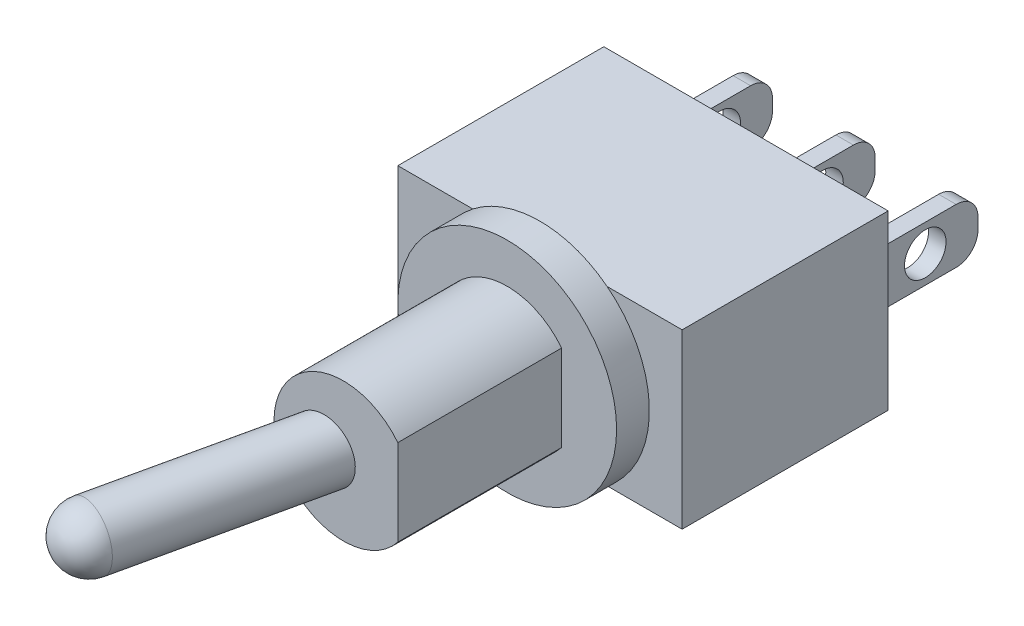
ISO-10303-21;
HEADER;
FILE_DESCRIPTION(('STEP AP214'),'2;1');
FILE_NAME('part.step','',(''),(''),'','','');
FILE_SCHEMA(('AUTOMOTIVE_DESIGN { 1 0 10303 214 1 1 1 1 }'));
ENDSEC;
DATA;
#1=APPLICATION_CONTEXT('core data for automotive mechanical design processes');
#2=APPLICATION_PROTOCOL_DEFINITION('international standard','automotive_design',2000,#1);
#3=PRODUCT_CONTEXT('',#1,'mechanical');
#4=PRODUCT('Part','Part','',(#3));
#5=PRODUCT_RELATED_PRODUCT_CATEGORY('part','',(#4));
#6=PRODUCT_DEFINITION_FORMATION('','',#4);
#7=PRODUCT_DEFINITION_CONTEXT('part definition',#1,'design');
#8=PRODUCT_DEFINITION('design','',#6,#7);
#9=PRODUCT_DEFINITION_SHAPE('','',#8);
#10=(LENGTH_UNIT() NAMED_UNIT(*) SI_UNIT(.MILLI.,.METRE.));
#11=(NAMED_UNIT(*) PLANE_ANGLE_UNIT() SI_UNIT($,.RADIAN.));
#12=(NAMED_UNIT(*) SI_UNIT($,.STERADIAN.) SOLID_ANGLE_UNIT());
#13=UNCERTAINTY_MEASURE_WITH_UNIT(LENGTH_MEASURE(1.E-05),#10,'distance_accuracy_value','');
#14=(GEOMETRIC_REPRESENTATION_CONTEXT(3) GLOBAL_UNCERTAINTY_ASSIGNED_CONTEXT((#13)) GLOBAL_UNIT_ASSIGNED_CONTEXT((#10,
#11,#12)) REPRESENTATION_CONTEXT('',''));
#15=CARTESIAN_POINT('',(0.,0.,0.));
#16=DIRECTION('',(0.,0.,1.));
#17=DIRECTION('',(1.,0.,0.));
#18=AXIS2_PLACEMENT_3D('',#15,#16,#17);
#19=CARTESIAN_POINT('',(0.,0.,0.));
#20=DIRECTION('',(0.,0.,1.));
#21=DIRECTION('',(1.,0.,0.));
#22=AXIS2_PLACEMENT_3D('',#19,#20,#21);
#23=PLANE('',#22);
#24=CARTESIAN_POINT('',(0.,0.,0.));
#25=DIRECTION('',(0.,0.,1.));
#26=DIRECTION('',(1.,0.,0.));
#27=AXIS2_PLACEMENT_3D('',#24,#25,#26);
#28=CIRCLE('',#27,5.0038);
#29=CARTESIAN_POINT('',(-3.07211398714306,3.9497,0.));
#30=VERTEX_POINT('',#29);
#31=CARTESIAN_POINT('',(-3.07211398714305,-3.9497,0.));
#32=VERTEX_POINT('',#31);
#33=EDGE_CURVE('E11',#30,#32,#28,.T.);
#34=ORIENTED_EDGE('',*,*,#33,.F.);
#35=DIRECTION('',(-1.,0.,0.));
#36=VECTOR('',#35,1.);
#37=CARTESIAN_POINT('',(6.5024,3.9497,0.));
#38=LINE('',#37,#36);
#39=CARTESIAN_POINT('',(-6.5024,3.9497,0.));
#40=VERTEX_POINT('',#39);
#41=EDGE_CURVE('E413',#30,#40,#38,.T.);
#42=ORIENTED_EDGE('',*,*,#41,.T.);
#43=DIRECTION('',(0.,1.,0.));
#44=VECTOR('',#43,1.);
#45=CARTESIAN_POINT('',(-6.5024,-3.9497,0.));
#46=LINE('',#45,#44);
#47=CARTESIAN_POINT('',(-6.5024,-3.9497,0.));
#48=VERTEX_POINT('',#47);
#49=EDGE_CURVE('E416',#48,#40,#46,.T.);
#50=ORIENTED_EDGE('',*,*,#49,.F.);
#51=DIRECTION('',(-1.,0.,0.));
#52=VECTOR('',#51,1.);
#53=CARTESIAN_POINT('',(6.5024,-3.9497,0.));
#54=LINE('',#53,#52);
#55=EDGE_CURVE('E68',#32,#48,#54,.T.);
#56=ORIENTED_EDGE('',*,*,#55,.F.);
#57=EDGE_LOOP('',(#34,#42,#50,#56));
#58=FACE_BOUND('',#57,.T.);
#59=ADVANCED_FACE('F43',(#58),#23,.T.);
#60=CARTESIAN_POINT('',(6.5024,-3.9497,-9.4234));
#61=DIRECTION('',(1.,0.,0.));
#62=DIRECTION('',(0.,0.,-1.));
#63=AXIS2_PLACEMENT_3D('',#60,#61,#62);
#64=PLANE('',#63);
#65=DIRECTION('',(0.,1.,0.));
#66=VECTOR('',#65,1.);
#67=CARTESIAN_POINT('',(6.5024,-3.9497,0.));
#68=LINE('',#67,#66);
#69=CARTESIAN_POINT('',(6.5024,-3.9497,0.));
#70=VERTEX_POINT('',#69);
#71=CARTESIAN_POINT('',(6.5024,3.9497,0.));
#72=VERTEX_POINT('',#71);
#73=EDGE_CURVE('E398',#70,#72,#68,.T.);
#74=ORIENTED_EDGE('',*,*,#73,.F.);
#75=DIRECTION('',(0.,0.,1.));
#76=VECTOR('',#75,1.);
#77=CARTESIAN_POINT('',(6.5024,-3.9497,-9.4234));
#78=LINE('',#77,#76);
#79=CARTESIAN_POINT('',(6.5024,-3.9497,-9.4234));
#80=VERTEX_POINT('',#79);
#81=EDGE_CURVE('E423',#80,#70,#78,.T.);
#82=ORIENTED_EDGE('',*,*,#81,.F.);
#83=DIRECTION('',(0.,1.,0.));
#84=VECTOR('',#83,1.);
#85=CARTESIAN_POINT('',(6.5024,-3.9497,-9.4234));
#86=LINE('',#85,#84);
#87=CARTESIAN_POINT('',(6.5024,3.9497,-9.4234));
#88=VERTEX_POINT('',#87);
#89=EDGE_CURVE('E399',#80,#88,#86,.T.);
#90=ORIENTED_EDGE('',*,*,#89,.T.);
#91=DIRECTION('',(0.,0.,1.));
#92=VECTOR('',#91,1.);
#93=CARTESIAN_POINT('',(6.5024,3.9497,-9.4234));
#94=LINE('',#93,#92);
#95=EDGE_CURVE('E410',#88,#72,#94,.T.);
#96=ORIENTED_EDGE('',*,*,#95,.T.);
#97=EDGE_LOOP('',(#74,#82,#90,#96));
#98=FACE_BOUND('',#97,.T.);
#99=ADVANCED_FACE('F45',(#98),#64,.T.);
#100=CARTESIAN_POINT('',(6.5024,-3.9497,-9.4234));
#101=DIRECTION('',(0.,1.,0.));
#102=DIRECTION('',(-1.,0.,0.));
#103=AXIS2_PLACEMENT_3D('',#100,#101,#102);
#104=PLANE('',#103);
#105=CARTESIAN_POINT('',(3.07211398714306,-3.9497,0.));
#106=VERTEX_POINT('',#105);
#107=EDGE_CURVE('E403',#70,#106,#54,.T.);
#108=ORIENTED_EDGE('',*,*,#107,.T.);
#109=EDGE_CURVE('E422',#106,#32,#54,.T.);
#110=ORIENTED_EDGE('',*,*,#109,.T.);
#111=ORIENTED_EDGE('',*,*,#55,.T.);
#112=DIRECTION('',(0.,0.,1.));
#113=VECTOR('',#112,1.);
#114=CARTESIAN_POINT('',(-6.5024,-3.9497,-9.4234));
#115=LINE('',#114,#113);
#116=CARTESIAN_POINT('',(-6.5024,-3.9497,-9.4234));
#117=VERTEX_POINT('',#116);
#118=EDGE_CURVE('E425',#117,#48,#115,.T.);
#119=ORIENTED_EDGE('',*,*,#118,.F.);
#120=DIRECTION('',(-1.,0.,0.));
#121=VECTOR('',#120,1.);
#122=CARTESIAN_POINT('',(6.5024,-3.9497,-9.4234));
#123=LINE('',#122,#121);
#124=EDGE_CURVE('E408',#80,#117,#123,.T.);
#125=ORIENTED_EDGE('',*,*,#124,.F.);
#126=ORIENTED_EDGE('',*,*,#81,.T.);
#127=EDGE_LOOP('',(#108,#110,#111,#119,#125,#126));
#128=FACE_BOUND('',#127,.T.);
#129=ADVANCED_FACE('F446',(#128),#104,.F.);
#130=CARTESIAN_POINT('',(-6.5024,-3.9497,-9.4234));
#131=DIRECTION('',(1.,0.,0.));
#132=DIRECTION('',(0.,0.,-1.));
#133=AXIS2_PLACEMENT_3D('',#130,#131,#132);
#134=PLANE('',#133);
#135=ORIENTED_EDGE('',*,*,#49,.T.);
#136=DIRECTION('',(0.,0.,1.));
#137=VECTOR('',#136,1.);
#138=CARTESIAN_POINT('',(-6.5024,3.9497,-9.4234));
#139=LINE('',#138,#137);
#140=CARTESIAN_POINT('',(-6.5024,3.9497,-9.4234));
#141=VERTEX_POINT('',#140);
#142=EDGE_CURVE('E428',#141,#40,#139,.T.);
#143=ORIENTED_EDGE('',*,*,#142,.F.);
#144=DIRECTION('',(0.,1.,0.));
#145=VECTOR('',#144,1.);
#146=CARTESIAN_POINT('',(-6.5024,-3.9497,-9.4234));
#147=LINE('',#146,#145);
#148=EDGE_CURVE('E406',#117,#141,#147,.T.);
#149=ORIENTED_EDGE('',*,*,#148,.F.);
#150=ORIENTED_EDGE('',*,*,#118,.T.);
#151=EDGE_LOOP('',(#135,#143,#149,#150));
#152=FACE_BOUND('',#151,.T.);
#153=ADVANCED_FACE('F496',(#152),#134,.F.);
#154=CARTESIAN_POINT('',(6.5024,3.9497,-9.4234));
#155=DIRECTION('',(0.,1.,0.));
#156=DIRECTION('',(-1.,0.,0.));
#157=AXIS2_PLACEMENT_3D('',#154,#155,#156);
#158=PLANE('',#157);
#159=CARTESIAN_POINT('',(3.07211398714306,3.9497,0.));
#160=VERTEX_POINT('',#159);
#161=EDGE_CURVE('E414',#72,#160,#38,.T.);
#162=ORIENTED_EDGE('',*,*,#161,.F.);
#163=ORIENTED_EDGE('',*,*,#95,.F.);
#164=DIRECTION('',(-1.,0.,0.));
#165=VECTOR('',#164,1.);
#166=CARTESIAN_POINT('',(6.5024,3.9497,-9.4234));
#167=LINE('',#166,#165);
#168=EDGE_CURVE('E402',#88,#141,#167,.T.);
#169=ORIENTED_EDGE('',*,*,#168,.T.);
#170=ORIENTED_EDGE('',*,*,#142,.T.);
#171=ORIENTED_EDGE('',*,*,#41,.F.);
#172=EDGE_CURVE('E417',#160,#30,#38,.T.);
#173=ORIENTED_EDGE('',*,*,#172,.F.);
#174=EDGE_LOOP('',(#162,#163,#169,#170,#171,#173));
#175=FACE_BOUND('',#174,.T.);
#176=ADVANCED_FACE('F437',(#175),#158,.T.);
#177=CARTESIAN_POINT('',(0.,0.,-9.4234));
#178=DIRECTION('',(0.,0.,1.));
#179=DIRECTION('',(1.,0.,0.));
#180=AXIS2_PLACEMENT_3D('',#177,#178,#179);
#181=PLANE('',#180);
#182=DIRECTION('',(-1.,0.,0.));
#183=VECTOR('',#182,1.);
#184=CARTESIAN_POINT('',(-4.3,-1.25,-9.4234));
#185=LINE('',#184,#183);
#186=CARTESIAN_POINT('',(-4.3,-1.25,-9.4234));
#187=VERTEX_POINT('',#186);
#188=CARTESIAN_POINT('',(-5.1,-1.25,-9.4234));
#189=VERTEX_POINT('',#188);
#190=EDGE_CURVE('E289',#187,#189,#185,.T.);
#191=ORIENTED_EDGE('',*,*,#190,.F.);
#192=DIRECTION('',(0.,1.,0.));
#193=VECTOR('',#192,1.);
#194=CARTESIAN_POINT('',(-4.3,0.,-9.4234));
#195=LINE('',#194,#193);
#196=CARTESIAN_POINT('',(-4.3,1.25,-9.4234));
#197=VERTEX_POINT('',#196);
#198=EDGE_CURVE('E253',#187,#197,#195,.T.);
#199=ORIENTED_EDGE('',*,*,#198,.T.);
#200=DIRECTION('',(-1.,0.,0.));
#201=VECTOR('',#200,1.);
#202=CARTESIAN_POINT('',(-4.3,1.25,-9.4234));
#203=LINE('',#202,#201);
#204=CARTESIAN_POINT('',(-5.1,1.25,-9.4234));
#205=VERTEX_POINT('',#204);
#206=EDGE_CURVE('E292',#197,#205,#203,.T.);
#207=ORIENTED_EDGE('',*,*,#206,.T.);
#208=DIRECTION('',(0.,1.,0.));
#209=VECTOR('',#208,1.);
#210=CARTESIAN_POINT('',(-5.1,0.,-9.4234));
#211=LINE('',#210,#209);
#212=EDGE_CURVE('E270',#189,#205,#211,.T.);
#213=ORIENTED_EDGE('',*,*,#212,.F.);
#214=EDGE_LOOP('',(#191,#199,#207,#213));
#215=FACE_BOUND('',#214,.T.);
#216=DIRECTION('',(-1.,0.,0.));
#217=VECTOR('',#216,1.);
#218=CARTESIAN_POINT('',(0.4,-1.25,-9.4234));
#219=LINE('',#218,#217);
#220=CARTESIAN_POINT('',(0.4,-1.25,-9.4234));
#221=VERTEX_POINT('',#220);
#222=CARTESIAN_POINT('',(-0.4,-1.25,-9.4234));
#223=VERTEX_POINT('',#222);
#224=EDGE_CURVE('E340',#221,#223,#219,.T.);
#225=ORIENTED_EDGE('',*,*,#224,.F.);
#226=DIRECTION('',(0.,1.,0.));
#227=VECTOR('',#226,1.);
#228=CARTESIAN_POINT('',(0.4,0.,-9.4234));
#229=LINE('',#228,#227);
#230=CARTESIAN_POINT('',(0.4,1.25,-9.4234));
#231=VERTEX_POINT('',#230);
#232=EDGE_CURVE('E304',#221,#231,#229,.T.);
#233=ORIENTED_EDGE('',*,*,#232,.T.);
#234=DIRECTION('',(-1.,0.,0.));
#235=VECTOR('',#234,1.);
#236=CARTESIAN_POINT('',(0.4,1.25,-9.4234));
#237=LINE('',#236,#235);
#238=CARTESIAN_POINT('',(-0.4,1.25,-9.4234));
#239=VERTEX_POINT('',#238);
#240=EDGE_CURVE('E343',#231,#239,#237,.T.);
#241=ORIENTED_EDGE('',*,*,#240,.T.);
#242=DIRECTION('',(0.,1.,0.));
#243=VECTOR('',#242,1.);
#244=CARTESIAN_POINT('',(-0.4,0.,-9.4234));
#245=LINE('',#244,#243);
#246=EDGE_CURVE('E321',#223,#239,#245,.T.);
#247=ORIENTED_EDGE('',*,*,#246,.F.);
#248=EDGE_LOOP('',(#225,#233,#241,#247));
#249=FACE_BOUND('',#248,.T.);
#250=DIRECTION('',(-1.,0.,0.));
#251=VECTOR('',#250,1.);
#252=CARTESIAN_POINT('',(5.1,-1.25,-9.4234));
#253=LINE('',#252,#251);
#254=CARTESIAN_POINT('',(5.1,-1.25,-9.4234));
#255=VERTEX_POINT('',#254);
#256=CARTESIAN_POINT('',(4.3,-1.25,-9.4234));
#257=VERTEX_POINT('',#256);
#258=EDGE_CURVE('E391',#255,#257,#253,.T.);
#259=ORIENTED_EDGE('',*,*,#258,.F.);
#260=DIRECTION('',(0.,1.,0.));
#261=VECTOR('',#260,1.);
#262=CARTESIAN_POINT('',(5.1,0.,-9.4234));
#263=LINE('',#262,#261);
#264=CARTESIAN_POINT('',(5.1,1.25,-9.4234));
#265=VERTEX_POINT('',#264);
#266=EDGE_CURVE('E355',#255,#265,#263,.T.);
#267=ORIENTED_EDGE('',*,*,#266,.T.);
#268=DIRECTION('',(-1.,0.,0.));
#269=VECTOR('',#268,1.);
#270=CARTESIAN_POINT('',(5.1,1.25,-9.4234));
#271=LINE('',#270,#269);
#272=CARTESIAN_POINT('',(4.3,1.25,-9.4234));
#273=VERTEX_POINT('',#272);
#274=EDGE_CURVE('E394',#265,#273,#271,.T.);
#275=ORIENTED_EDGE('',*,*,#274,.T.);
#276=DIRECTION('',(0.,1.,0.));
#277=VECTOR('',#276,1.);
#278=CARTESIAN_POINT('',(4.3,0.,-9.4234));
#279=LINE('',#278,#277);
#280=EDGE_CURVE('E372',#257,#273,#279,.T.);
#281=ORIENTED_EDGE('',*,*,#280,.F.);
#282=EDGE_LOOP('',(#259,#267,#275,#281));
#283=FACE_BOUND('',#282,.T.);
#284=ORIENTED_EDGE('',*,*,#89,.F.);
#285=ORIENTED_EDGE('',*,*,#124,.T.);
#286=ORIENTED_EDGE('',*,*,#148,.T.);
#287=ORIENTED_EDGE('',*,*,#168,.F.);
#288=EDGE_LOOP('',(#284,#285,#286,#287));
#289=FACE_BOUND('',#288,.T.);
#290=ADVANCED_FACE('F482',(#215,#249,#283,#289),#181,.F.);
#291=EDGE_CURVE('E52',#106,#160,#28,.T.);
#292=ORIENTED_EDGE('',*,*,#291,.F.);
#293=ORIENTED_EDGE('',*,*,#107,.F.);
#294=ORIENTED_EDGE('',*,*,#73,.T.);
#295=ORIENTED_EDGE('',*,*,#161,.T.);
#296=EDGE_LOOP('',(#292,#293,#294,#295));
#297=FACE_BOUND('',#296,.T.);
#298=ADVANCED_FACE('F443',(#297),#23,.T.);
#299=CARTESIAN_POINT('',(5.1,0.250000000000001,-13.9352));
#300=DIRECTION('',(-1.,0.,0.));
#301=DIRECTION('',(0.,0.,1.));
#302=AXIS2_PLACEMENT_3D('',#299,#300,#301);
#303=CYLINDRICAL_SURFACE('',#302,1.);
#304=CARTESIAN_POINT('',(4.3,0.250000000000001,-13.9352));
#305=DIRECTION('',(1.,0.,0.));
#306=DIRECTION('',(0.,0.,-1.));
#307=AXIS2_PLACEMENT_3D('',#304,#305,#306);
#308=CIRCLE('',#307,1.);
#309=CARTESIAN_POINT('',(4.3,1.25,-13.9352));
#310=VERTEX_POINT('',#309);
#311=CARTESIAN_POINT('',(4.3,0.250000000000001,-14.9352));
#312=VERTEX_POINT('',#311);
#313=EDGE_CURVE('E347',#310,#312,#308,.F.);
#314=ORIENTED_EDGE('',*,*,#313,.F.);
#315=DIRECTION('',(-1.,0.,0.));
#316=VECTOR('',#315,1.);
#317=CARTESIAN_POINT('',(5.1,1.25,-13.9352));
#318=LINE('',#317,#316);
#319=CARTESIAN_POINT('',(5.1,1.25,-13.9352));
#320=VERTEX_POINT('',#319);
#321=EDGE_CURVE('E396',#320,#310,#318,.T.);
#322=ORIENTED_EDGE('',*,*,#321,.F.);
#323=CARTESIAN_POINT('',(5.1,0.250000000000001,-13.9352));
#324=DIRECTION('',(1.,0.,0.));
#325=DIRECTION('',(0.,0.,-1.));
#326=AXIS2_PLACEMENT_3D('',#323,#324,#325);
#327=CIRCLE('',#326,1.);
#328=CARTESIAN_POINT('',(5.1,0.250000000000001,-14.9352));
#329=VERTEX_POINT('',#328);
#330=EDGE_CURVE('E348',#320,#329,#327,.F.);
#331=ORIENTED_EDGE('',*,*,#330,.T.);
#332=DIRECTION('',(-1.,0.,0.));
#333=VECTOR('',#332,1.);
#334=CARTESIAN_POINT('',(5.1,0.250000000000001,-14.9352));
#335=LINE('',#334,#333);
#336=EDGE_CURVE('E366',#329,#312,#335,.T.);
#337=ORIENTED_EDGE('',*,*,#336,.T.);
#338=EDGE_LOOP('',(#314,#322,#331,#337));
#339=FACE_BOUND('',#338,.T.);
#340=ADVANCED_FACE('F481',(#339),#303,.T.);
#341=CARTESIAN_POINT('',(5.1,1.25,0.));
#342=DIRECTION('',(0.,1.,0.));
#343=DIRECTION('',(0.,0.,1.));
#344=AXIS2_PLACEMENT_3D('',#341,#342,#343);
#345=PLANE('',#344);
#346=DIRECTION('',(0.,0.,-1.));
#347=VECTOR('',#346,1.);
#348=CARTESIAN_POINT('',(4.3,1.25,0.));
#349=LINE('',#348,#347);
#350=EDGE_CURVE('E369',#273,#310,#349,.T.);
#351=ORIENTED_EDGE('',*,*,#350,.F.);
#352=ORIENTED_EDGE('',*,*,#274,.F.);
#353=DIRECTION('',(0.,0.,-1.));
#354=VECTOR('',#353,1.);
#355=CARTESIAN_POINT('',(5.1,1.25,0.));
#356=LINE('',#355,#354);
#357=EDGE_CURVE('E351',#265,#320,#356,.T.);
#358=ORIENTED_EDGE('',*,*,#357,.T.);
#359=ORIENTED_EDGE('',*,*,#321,.T.);
#360=EDGE_LOOP('',(#351,#352,#358,#359));
#361=FACE_BOUND('',#360,.T.);
#362=ADVANCED_FACE('F487',(#361),#345,.T.);
#363=CARTESIAN_POINT('',(5.1,-1.25,0.));
#364=DIRECTION('',(0.,1.,0.));
#365=DIRECTION('',(0.,0.,1.));
#366=AXIS2_PLACEMENT_3D('',#363,#364,#365);
#367=PLANE('',#366);
#368=DIRECTION('',(0.,0.,-1.));
#369=VECTOR('',#368,1.);
#370=CARTESIAN_POINT('',(4.3,-1.25,0.));
#371=LINE('',#370,#369);
#372=CARTESIAN_POINT('',(4.3,-1.25,-13.9352));
#373=VERTEX_POINT('',#372);
#374=EDGE_CURVE('E375',#257,#373,#371,.T.);
#375=ORIENTED_EDGE('',*,*,#374,.T.);
#376=DIRECTION('',(-1.,0.,0.));
#377=VECTOR('',#376,1.);
#378=CARTESIAN_POINT('',(5.1,-1.25,-13.9352));
#379=LINE('',#378,#377);
#380=CARTESIAN_POINT('',(5.1,-1.25,-13.9352));
#381=VERTEX_POINT('',#380);
#382=EDGE_CURVE('E388',#381,#373,#379,.T.);
#383=ORIENTED_EDGE('',*,*,#382,.F.);
#384=DIRECTION('',(0.,0.,-1.));
#385=VECTOR('',#384,1.);
#386=CARTESIAN_POINT('',(5.1,-1.25,0.));
#387=LINE('',#386,#385);
#388=EDGE_CURVE('E357',#255,#381,#387,.T.);
#389=ORIENTED_EDGE('',*,*,#388,.F.);
#390=ORIENTED_EDGE('',*,*,#258,.T.);
#391=EDGE_LOOP('',(#375,#383,#389,#390));
#392=FACE_BOUND('',#391,.T.);
#393=ADVANCED_FACE('F501',(#392),#367,.F.);
#394=CARTESIAN_POINT('',(5.1,-0.250000000000001,-13.9352));
#395=DIRECTION('',(-1.,0.,0.));
#396=DIRECTION('',(0.,0.,1.));
#397=AXIS2_PLACEMENT_3D('',#394,#395,#396);
#398=CYLINDRICAL_SURFACE('',#397,1.);
#399=CARTESIAN_POINT('',(4.3,-0.250000000000001,-13.9352));
#400=DIRECTION('',(1.,0.,0.));
#401=DIRECTION('',(0.,0.,-1.));
#402=AXIS2_PLACEMENT_3D('',#399,#400,#401);
#403=CIRCLE('',#402,1.);
#404=CARTESIAN_POINT('',(4.3,-0.250000000000001,-14.9352));
#405=VERTEX_POINT('',#404);
#406=EDGE_CURVE('E377',#373,#405,#403,.T.);
#407=ORIENTED_EDGE('',*,*,#406,.T.);
#408=DIRECTION('',(-1.,0.,0.));
#409=VECTOR('',#408,1.);
#410=CARTESIAN_POINT('',(5.1,-0.250000000000001,-14.9352));
#411=LINE('',#410,#409);
#412=CARTESIAN_POINT('',(5.1,-0.250000000000001,-14.9352));
#413=VERTEX_POINT('',#412);
#414=EDGE_CURVE('E385',#413,#405,#411,.T.);
#415=ORIENTED_EDGE('',*,*,#414,.F.);
#416=CARTESIAN_POINT('',(5.1,-0.250000000000001,-13.9352));
#417=DIRECTION('',(1.,0.,0.));
#418=DIRECTION('',(0.,0.,-1.));
#419=AXIS2_PLACEMENT_3D('',#416,#417,#418);
#420=CIRCLE('',#419,1.);
#421=EDGE_CURVE('E359',#381,#413,#420,.T.);
#422=ORIENTED_EDGE('',*,*,#421,.F.);
#423=ORIENTED_EDGE('',*,*,#382,.T.);
#424=EDGE_LOOP('',(#407,#415,#422,#423));
#425=FACE_BOUND('',#424,.T.);
#426=ADVANCED_FACE('F505',(#425),#398,.T.);
#427=CARTESIAN_POINT('',(5.1,0.,-14.9352));
#428=DIRECTION('',(0.,0.,1.));
#429=DIRECTION('',(1.,0.,0.));
#430=AXIS2_PLACEMENT_3D('',#427,#428,#429);
#431=PLANE('',#430);
#432=DIRECTION('',(0.,1.,0.));
#433=VECTOR('',#432,1.);
#434=CARTESIAN_POINT('',(4.3,0.,-14.9352));
#435=LINE('',#434,#433);
#436=EDGE_CURVE('E379',#405,#312,#435,.T.);
#437=ORIENTED_EDGE('',*,*,#436,.T.);
#438=ORIENTED_EDGE('',*,*,#336,.F.);
#439=DIRECTION('',(0.,1.,0.));
#440=VECTOR('',#439,1.);
#441=CARTESIAN_POINT('',(5.1,0.,-14.9352));
#442=LINE('',#441,#440);
#443=EDGE_CURVE('E361',#413,#329,#442,.T.);
#444=ORIENTED_EDGE('',*,*,#443,.F.);
#445=ORIENTED_EDGE('',*,*,#414,.T.);
#446=EDGE_LOOP('',(#437,#438,#444,#445));
#447=FACE_BOUND('',#446,.T.);
#448=ADVANCED_FACE('F509',(#447),#431,.F.);
#449=CARTESIAN_POINT('',(5.1,0.,-12.5234));
#450=DIRECTION('',(-1.,0.,0.));
#451=DIRECTION('',(0.,0.,1.));
#452=AXIS2_PLACEMENT_3D('',#449,#450,#451);
#453=CYLINDRICAL_SURFACE('',#452,0.949999999999999);
#454=CARTESIAN_POINT('',(5.1,0.,-12.5234));
#455=DIRECTION('',(1.,0.,0.));
#456=DIRECTION('',(0.,0.,-1.));
#457=AXIS2_PLACEMENT_3D('',#454,#455,#456);
#458=CIRCLE('',#457,0.949999999999999);
#459=CARTESIAN_POINT('',(5.1,0.,-13.4734));
#460=VERTEX_POINT('',#459);
#461=EDGE_CURVE('E363',#460,#460,#458,.T.);
#462=ORIENTED_EDGE('',*,*,#461,.T.);
#463=EDGE_LOOP('',(#462));
#464=FACE_BOUND('',#463,.T.);
#465=CARTESIAN_POINT('',(4.3,0.,-12.5234));
#466=DIRECTION('',(1.,0.,0.));
#467=DIRECTION('',(0.,0.,-1.));
#468=AXIS2_PLACEMENT_3D('',#465,#466,#467);
#469=CIRCLE('',#468,0.949999999999999);
#470=CARTESIAN_POINT('',(4.3,0.,-13.4734));
#471=VERTEX_POINT('',#470);
#472=EDGE_CURVE('E352',#471,#471,#469,.T.);
#473=ORIENTED_EDGE('',*,*,#472,.F.);
#474=EDGE_LOOP('',(#473));
#475=FACE_BOUND('',#474,.T.);
#476=ADVANCED_FACE('F513',(#464,#475),#453,.F.);
#477=CARTESIAN_POINT('',(5.1,0.,0.));
#478=DIRECTION('',(1.,0.,0.));
#479=DIRECTION('',(0.,0.,-1.));
#480=AXIS2_PLACEMENT_3D('',#477,#478,#479);
#481=PLANE('',#480);
#482=ORIENTED_EDGE('',*,*,#330,.F.);
#483=ORIENTED_EDGE('',*,*,#357,.F.);
#484=ORIENTED_EDGE('',*,*,#266,.F.);
#485=ORIENTED_EDGE('',*,*,#388,.T.);
#486=ORIENTED_EDGE('',*,*,#421,.T.);
#487=ORIENTED_EDGE('',*,*,#443,.T.);
#488=EDGE_LOOP('',(#482,#483,#484,#485,#486,#487));
#489=FACE_BOUND('',#488,.T.);
#490=ORIENTED_EDGE('',*,*,#461,.F.);
#491=EDGE_LOOP('',(#490));
#492=FACE_BOUND('',#491,.T.);
#493=ADVANCED_FACE('F517',(#489,#492),#481,.T.);
#494=CARTESIAN_POINT('',(4.3,0.,0.));
#495=DIRECTION('',(1.,0.,0.));
#496=DIRECTION('',(0.,0.,-1.));
#497=AXIS2_PLACEMENT_3D('',#494,#495,#496);
#498=PLANE('',#497);
#499=ORIENTED_EDGE('',*,*,#313,.T.);
#500=ORIENTED_EDGE('',*,*,#436,.F.);
#501=ORIENTED_EDGE('',*,*,#406,.F.);
#502=ORIENTED_EDGE('',*,*,#374,.F.);
#503=ORIENTED_EDGE('',*,*,#280,.T.);
#504=ORIENTED_EDGE('',*,*,#350,.T.);
#505=EDGE_LOOP('',(#499,#500,#501,#502,#503,#504));
#506=FACE_BOUND('',#505,.T.);
#507=ORIENTED_EDGE('',*,*,#472,.T.);
#508=EDGE_LOOP('',(#507));
#509=FACE_BOUND('',#508,.T.);
#510=ADVANCED_FACE('F519',(#506,#509),#498,.F.);
#511=CARTESIAN_POINT('',(0.4,0.25,-13.9352));
#512=DIRECTION('',(-1.,0.,0.));
#513=DIRECTION('',(0.,0.,1.));
#514=AXIS2_PLACEMENT_3D('',#511,#512,#513);
#515=CYLINDRICAL_SURFACE('',#514,1.);
#516=CARTESIAN_POINT('',(-0.4,0.25,-13.9352));
#517=DIRECTION('',(1.,0.,0.));
#518=DIRECTION('',(0.,0.,-1.));
#519=AXIS2_PLACEMENT_3D('',#516,#517,#518);
#520=CIRCLE('',#519,1.);
#521=CARTESIAN_POINT('',(-0.4,1.25,-13.9352));
#522=VERTEX_POINT('',#521);
#523=CARTESIAN_POINT('',(-0.4,0.25,-14.9352));
#524=VERTEX_POINT('',#523);
#525=EDGE_CURVE('E296',#522,#524,#520,.F.);
#526=ORIENTED_EDGE('',*,*,#525,.F.);
#527=DIRECTION('',(-1.,0.,0.));
#528=VECTOR('',#527,1.);
#529=CARTESIAN_POINT('',(0.4,1.25,-13.9352));
#530=LINE('',#529,#528);
#531=CARTESIAN_POINT('',(0.4,1.25,-13.9352));
#532=VERTEX_POINT('',#531);
#533=EDGE_CURVE('E345',#532,#522,#530,.T.);
#534=ORIENTED_EDGE('',*,*,#533,.F.);
#535=CARTESIAN_POINT('',(0.4,0.25,-13.9352));
#536=DIRECTION('',(1.,0.,0.));
#537=DIRECTION('',(0.,0.,-1.));
#538=AXIS2_PLACEMENT_3D('',#535,#536,#537);
#539=CIRCLE('',#538,1.);
#540=CARTESIAN_POINT('',(0.4,0.25,-14.9352));
#541=VERTEX_POINT('',#540);
#542=EDGE_CURVE('E297',#532,#541,#539,.F.);
#543=ORIENTED_EDGE('',*,*,#542,.T.);
#544=DIRECTION('',(-1.,0.,0.));
#545=VECTOR('',#544,1.);
#546=CARTESIAN_POINT('',(0.4,0.25,-14.9352));
#547=LINE('',#546,#545);
#548=EDGE_CURVE('E315',#541,#524,#547,.T.);
#549=ORIENTED_EDGE('',*,*,#548,.T.);
#550=EDGE_LOOP('',(#526,#534,#543,#549));
#551=FACE_BOUND('',#550,.T.);
#552=ADVANCED_FACE('F521',(#551),#515,.T.);
#553=CARTESIAN_POINT('',(0.4,1.25,0.));
#554=DIRECTION('',(0.,1.,0.));
#555=DIRECTION('',(0.,0.,1.));
#556=AXIS2_PLACEMENT_3D('',#553,#554,#555);
#557=PLANE('',#556);
#558=DIRECTION('',(0.,0.,-1.));
#559=VECTOR('',#558,1.);
#560=CARTESIAN_POINT('',(-0.4,1.25,0.));
#561=LINE('',#560,#559);
#562=EDGE_CURVE('E318',#239,#522,#561,.T.);
#563=ORIENTED_EDGE('',*,*,#562,.F.);
#564=ORIENTED_EDGE('',*,*,#240,.F.);
#565=DIRECTION('',(0.,0.,-1.));
#566=VECTOR('',#565,1.);
#567=CARTESIAN_POINT('',(0.4,1.25,0.));
#568=LINE('',#567,#566);
#569=EDGE_CURVE('E300',#231,#532,#568,.T.);
#570=ORIENTED_EDGE('',*,*,#569,.T.);
#571=ORIENTED_EDGE('',*,*,#533,.T.);
#572=EDGE_LOOP('',(#563,#564,#570,#571));
#573=FACE_BOUND('',#572,.T.);
#574=ADVANCED_FACE('F527',(#573),#557,.T.);
#575=CARTESIAN_POINT('',(0.4,-1.25,0.));
#576=DIRECTION('',(0.,1.,0.));
#577=DIRECTION('',(0.,0.,1.));
#578=AXIS2_PLACEMENT_3D('',#575,#576,#577);
#579=PLANE('',#578);
#580=DIRECTION('',(0.,0.,-1.));
#581=VECTOR('',#580,1.);
#582=CARTESIAN_POINT('',(-0.4,-1.25,0.));
#583=LINE('',#582,#581);
#584=CARTESIAN_POINT('',(-0.4,-1.25,-13.9352));
#585=VERTEX_POINT('',#584);
#586=EDGE_CURVE('E324',#223,#585,#583,.T.);
#587=ORIENTED_EDGE('',*,*,#586,.T.);
#588=DIRECTION('',(-1.,0.,0.));
#589=VECTOR('',#588,1.);
#590=CARTESIAN_POINT('',(0.4,-1.25,-13.9352));
#591=LINE('',#590,#589);
#592=CARTESIAN_POINT('',(0.4,-1.25,-13.9352));
#593=VERTEX_POINT('',#592);
#594=EDGE_CURVE('E337',#593,#585,#591,.T.);
#595=ORIENTED_EDGE('',*,*,#594,.F.);
#596=DIRECTION('',(0.,0.,-1.));
#597=VECTOR('',#596,1.);
#598=CARTESIAN_POINT('',(0.4,-1.25,0.));
#599=LINE('',#598,#597);
#600=EDGE_CURVE('E306',#221,#593,#599,.T.);
#601=ORIENTED_EDGE('',*,*,#600,.F.);
#602=ORIENTED_EDGE('',*,*,#224,.T.);
#603=EDGE_LOOP('',(#587,#595,#601,#602));
#604=FACE_BOUND('',#603,.T.);
#605=ADVANCED_FACE('F531',(#604),#579,.F.);
#606=CARTESIAN_POINT('',(0.4,-0.250000000000001,-13.9352));
#607=DIRECTION('',(-1.,0.,0.));
#608=DIRECTION('',(0.,0.,1.));
#609=AXIS2_PLACEMENT_3D('',#606,#607,#608);
#610=CYLINDRICAL_SURFACE('',#609,1.);
#611=CARTESIAN_POINT('',(-0.4,-0.250000000000001,-13.9352));
#612=DIRECTION('',(1.,0.,0.));
#613=DIRECTION('',(0.,0.,-1.));
#614=AXIS2_PLACEMENT_3D('',#611,#612,#613);
#615=CIRCLE('',#614,1.);
#616=CARTESIAN_POINT('',(-0.4,-0.250000000000001,-14.9352));
#617=VERTEX_POINT('',#616);
#618=EDGE_CURVE('E326',#585,#617,#615,.T.);
#619=ORIENTED_EDGE('',*,*,#618,.T.);
#620=DIRECTION('',(-1.,0.,0.));
#621=VECTOR('',#620,1.);
#622=CARTESIAN_POINT('',(0.4,-0.250000000000001,-14.9352));
#623=LINE('',#622,#621);
#624=CARTESIAN_POINT('',(0.4,-0.250000000000001,-14.9352));
#625=VERTEX_POINT('',#624);
#626=EDGE_CURVE('E334',#625,#617,#623,.T.);
#627=ORIENTED_EDGE('',*,*,#626,.F.);
#628=CARTESIAN_POINT('',(0.4,-0.250000000000001,-13.9352));
#629=DIRECTION('',(1.,0.,0.));
#630=DIRECTION('',(0.,0.,-1.));
#631=AXIS2_PLACEMENT_3D('',#628,#629,#630);
#632=CIRCLE('',#631,1.);
#633=EDGE_CURVE('E308',#593,#625,#632,.T.);
#634=ORIENTED_EDGE('',*,*,#633,.F.);
#635=ORIENTED_EDGE('',*,*,#594,.T.);
#636=EDGE_LOOP('',(#619,#627,#634,#635));
#637=FACE_BOUND('',#636,.T.);
#638=ADVANCED_FACE('F535',(#637),#610,.T.);
#639=CARTESIAN_POINT('',(0.4,0.,-14.9352));
#640=DIRECTION('',(0.,0.,1.));
#641=DIRECTION('',(1.,0.,0.));
#642=AXIS2_PLACEMENT_3D('',#639,#640,#641);
#643=PLANE('',#642);
#644=DIRECTION('',(0.,1.,0.));
#645=VECTOR('',#644,1.);
#646=CARTESIAN_POINT('',(-0.4,0.,-14.9352));
#647=LINE('',#646,#645);
#648=EDGE_CURVE('E328',#617,#524,#647,.T.);
#649=ORIENTED_EDGE('',*,*,#648,.T.);
#650=ORIENTED_EDGE('',*,*,#548,.F.);
#651=DIRECTION('',(0.,1.,0.));
#652=VECTOR('',#651,1.);
#653=CARTESIAN_POINT('',(0.4,0.,-14.9352));
#654=LINE('',#653,#652);
#655=EDGE_CURVE('E310',#625,#541,#654,.T.);
#656=ORIENTED_EDGE('',*,*,#655,.F.);
#657=ORIENTED_EDGE('',*,*,#626,.T.);
#658=EDGE_LOOP('',(#649,#650,#656,#657));
#659=FACE_BOUND('',#658,.T.);
#660=ADVANCED_FACE('F539',(#659),#643,.F.);
#661=CARTESIAN_POINT('',(0.4,0.,-12.5234));
#662=DIRECTION('',(-1.,0.,0.));
#663=DIRECTION('',(0.,0.,1.));
#664=AXIS2_PLACEMENT_3D('',#661,#662,#663);
#665=CYLINDRICAL_SURFACE('',#664,0.949999999999999);
#666=CARTESIAN_POINT('',(0.4,0.,-12.5234));
#667=DIRECTION('',(1.,0.,0.));
#668=DIRECTION('',(0.,0.,-1.));
#669=AXIS2_PLACEMENT_3D('',#666,#667,#668);
#670=CIRCLE('',#669,0.949999999999999);
#671=CARTESIAN_POINT('',(0.4,0.,-13.4734));
#672=VERTEX_POINT('',#671);
#673=EDGE_CURVE('E312',#672,#672,#670,.T.);
#674=ORIENTED_EDGE('',*,*,#673,.T.);
#675=EDGE_LOOP('',(#674));
#676=FACE_BOUND('',#675,.T.);
#677=CARTESIAN_POINT('',(-0.4,0.,-12.5234));
#678=DIRECTION('',(1.,0.,0.));
#679=DIRECTION('',(0.,0.,-1.));
#680=AXIS2_PLACEMENT_3D('',#677,#678,#679);
#681=CIRCLE('',#680,0.949999999999999);
#682=CARTESIAN_POINT('',(-0.4,0.,-13.4734));
#683=VERTEX_POINT('',#682);
#684=EDGE_CURVE('E301',#683,#683,#681,.T.);
#685=ORIENTED_EDGE('',*,*,#684,.F.);
#686=EDGE_LOOP('',(#685));
#687=FACE_BOUND('',#686,.T.);
#688=ADVANCED_FACE('F543',(#676,#687),#665,.F.);
#689=CARTESIAN_POINT('',(0.4,0.,0.));
#690=DIRECTION('',(1.,0.,0.));
#691=DIRECTION('',(0.,0.,-1.));
#692=AXIS2_PLACEMENT_3D('',#689,#690,#691);
#693=PLANE('',#692);
#694=ORIENTED_EDGE('',*,*,#542,.F.);
#695=ORIENTED_EDGE('',*,*,#569,.F.);
#696=ORIENTED_EDGE('',*,*,#232,.F.);
#697=ORIENTED_EDGE('',*,*,#600,.T.);
#698=ORIENTED_EDGE('',*,*,#633,.T.);
#699=ORIENTED_EDGE('',*,*,#655,.T.);
#700=EDGE_LOOP('',(#694,#695,#696,#697,#698,#699));
#701=FACE_BOUND('',#700,.T.);
#702=ORIENTED_EDGE('',*,*,#673,.F.);
#703=EDGE_LOOP('',(#702));
#704=FACE_BOUND('',#703,.T.);
#705=ADVANCED_FACE('F547',(#701,#704),#693,.T.);
#706=CARTESIAN_POINT('',(-0.4,0.,0.));
#707=DIRECTION('',(1.,0.,0.));
#708=DIRECTION('',(0.,0.,-1.));
#709=AXIS2_PLACEMENT_3D('',#706,#707,#708);
#710=PLANE('',#709);
#711=ORIENTED_EDGE('',*,*,#525,.T.);
#712=ORIENTED_EDGE('',*,*,#648,.F.);
#713=ORIENTED_EDGE('',*,*,#618,.F.);
#714=ORIENTED_EDGE('',*,*,#586,.F.);
#715=ORIENTED_EDGE('',*,*,#246,.T.);
#716=ORIENTED_EDGE('',*,*,#562,.T.);
#717=EDGE_LOOP('',(#711,#712,#713,#714,#715,#716));
#718=FACE_BOUND('',#717,.T.);
#719=ORIENTED_EDGE('',*,*,#684,.T.);
#720=EDGE_LOOP('',(#719));
#721=FACE_BOUND('',#720,.T.);
#722=ADVANCED_FACE('F549',(#718,#721),#710,.F.);
#723=CARTESIAN_POINT('',(-4.3,0.25,-13.9352));
#724=DIRECTION('',(-1.,0.,0.));
#725=DIRECTION('',(0.,0.,1.));
#726=AXIS2_PLACEMENT_3D('',#723,#724,#725);
#727=CYLINDRICAL_SURFACE('',#726,1.);
#728=CARTESIAN_POINT('',(-5.1,0.25,-13.9352));
#729=DIRECTION('',(1.,0.,0.));
#730=DIRECTION('',(0.,0.,-1.));
#731=AXIS2_PLACEMENT_3D('',#728,#729,#730);
#732=CIRCLE('',#731,1.);
#733=CARTESIAN_POINT('',(-5.1,1.25,-13.9352));
#734=VERTEX_POINT('',#733);
#735=CARTESIAN_POINT('',(-5.1,0.25,-14.9352));
#736=VERTEX_POINT('',#735);
#737=EDGE_CURVE('E243',#734,#736,#732,.F.);
#738=ORIENTED_EDGE('',*,*,#737,.F.);
#739=DIRECTION('',(-1.,0.,0.));
#740=VECTOR('',#739,1.);
#741=CARTESIAN_POINT('',(-4.3,1.25,-13.9352));
#742=LINE('',#741,#740);
#743=CARTESIAN_POINT('',(-4.3,1.25,-13.9352));
#744=VERTEX_POINT('',#743);
#745=EDGE_CURVE('E294',#744,#734,#742,.T.);
#746=ORIENTED_EDGE('',*,*,#745,.F.);
#747=CARTESIAN_POINT('',(-4.3,0.25,-13.9352));
#748=DIRECTION('',(1.,0.,0.));
#749=DIRECTION('',(0.,0.,-1.));
#750=AXIS2_PLACEMENT_3D('',#747,#748,#749);
#751=CIRCLE('',#750,1.);
#752=CARTESIAN_POINT('',(-4.3,0.25,-14.9352));
#753=VERTEX_POINT('',#752);
#754=EDGE_CURVE('E246',#744,#753,#751,.F.);
#755=ORIENTED_EDGE('',*,*,#754,.T.);
#756=DIRECTION('',(-1.,0.,0.));
#757=VECTOR('',#756,1.);
#758=CARTESIAN_POINT('',(-4.3,0.25,-14.9352));
#759=LINE('',#758,#757);
#760=EDGE_CURVE('E264',#753,#736,#759,.T.);
#761=ORIENTED_EDGE('',*,*,#760,.T.);
#762=EDGE_LOOP('',(#738,#746,#755,#761));
#763=FACE_BOUND('',#762,.T.);
#764=ADVANCED_FACE('F552',(#763),#727,.T.);
#765=CARTESIAN_POINT('',(-4.3,1.25,0.));
#766=DIRECTION('',(0.,1.,0.));
#767=DIRECTION('',(0.,0.,1.));
#768=AXIS2_PLACEMENT_3D('',#765,#766,#767);
#769=PLANE('',#768);
#770=DIRECTION('',(0.,0.,-1.));
#771=VECTOR('',#770,1.);
#772=CARTESIAN_POINT('',(-5.1,1.25,0.));
#773=LINE('',#772,#771);
#774=EDGE_CURVE('E267',#205,#734,#773,.T.);
#775=ORIENTED_EDGE('',*,*,#774,.F.);
#776=ORIENTED_EDGE('',*,*,#206,.F.);
#777=DIRECTION('',(0.,0.,-1.));
#778=VECTOR('',#777,1.);
#779=CARTESIAN_POINT('',(-4.3,1.25,0.));
#780=LINE('',#779,#778);
#781=EDGE_CURVE('E249',#197,#744,#780,.T.);
#782=ORIENTED_EDGE('',*,*,#781,.T.);
#783=ORIENTED_EDGE('',*,*,#745,.T.);
#784=EDGE_LOOP('',(#775,#776,#782,#783));
#785=FACE_BOUND('',#784,.T.);
#786=ADVANCED_FACE('F559',(#785),#769,.T.);
#787=CARTESIAN_POINT('',(-4.3,-1.25,0.));
#788=DIRECTION('',(0.,1.,0.));
#789=DIRECTION('',(0.,0.,1.));
#790=AXIS2_PLACEMENT_3D('',#787,#788,#789);
#791=PLANE('',#790);
#792=DIRECTION('',(0.,0.,-1.));
#793=VECTOR('',#792,1.);
#794=CARTESIAN_POINT('',(-5.1,-1.25,0.));
#795=LINE('',#794,#793);
#796=CARTESIAN_POINT('',(-5.1,-1.25,-13.9352));
#797=VERTEX_POINT('',#796);
#798=EDGE_CURVE('E273',#189,#797,#795,.T.);
#799=ORIENTED_EDGE('',*,*,#798,.T.);
#800=DIRECTION('',(-1.,0.,0.));
#801=VECTOR('',#800,1.);
#802=CARTESIAN_POINT('',(-4.3,-1.25,-13.9352));
#803=LINE('',#802,#801);
#804=CARTESIAN_POINT('',(-4.3,-1.25,-13.9352));
#805=VERTEX_POINT('',#804);
#806=EDGE_CURVE('E286',#805,#797,#803,.T.);
#807=ORIENTED_EDGE('',*,*,#806,.F.);
#808=DIRECTION('',(0.,0.,-1.));
#809=VECTOR('',#808,1.);
#810=CARTESIAN_POINT('',(-4.3,-1.25,0.));
#811=LINE('',#810,#809);
#812=EDGE_CURVE('E255',#187,#805,#811,.T.);
#813=ORIENTED_EDGE('',*,*,#812,.F.);
#814=ORIENTED_EDGE('',*,*,#190,.T.);
#815=EDGE_LOOP('',(#799,#807,#813,#814));
#816=FACE_BOUND('',#815,.T.);
#817=ADVANCED_FACE('F563',(#816),#791,.F.);
#818=CARTESIAN_POINT('',(-4.3,-0.250000000000002,-13.9352));
#819=DIRECTION('',(-1.,0.,0.));
#820=DIRECTION('',(0.,0.,1.));
#821=AXIS2_PLACEMENT_3D('',#818,#819,#820);
#822=CYLINDRICAL_SURFACE('',#821,1.);
#823=CARTESIAN_POINT('',(-5.1,-0.250000000000002,-13.9352));
#824=DIRECTION('',(1.,0.,0.));
#825=DIRECTION('',(0.,0.,-1.));
#826=AXIS2_PLACEMENT_3D('',#823,#824,#825);
#827=CIRCLE('',#826,1.);
#828=CARTESIAN_POINT('',(-5.1,-0.250000000000002,-14.9352));
#829=VERTEX_POINT('',#828);
#830=EDGE_CURVE('E275',#797,#829,#827,.T.);
#831=ORIENTED_EDGE('',*,*,#830,.T.);
#832=DIRECTION('',(-1.,0.,0.));
#833=VECTOR('',#832,1.);
#834=CARTESIAN_POINT('',(-4.3,-0.250000000000002,-14.9352));
#835=LINE('',#834,#833);
#836=CARTESIAN_POINT('',(-4.3,-0.250000000000002,-14.9352));
#837=VERTEX_POINT('',#836);
#838=EDGE_CURVE('E283',#837,#829,#835,.T.);
#839=ORIENTED_EDGE('',*,*,#838,.F.);
#840=CARTESIAN_POINT('',(-4.3,-0.250000000000002,-13.9352));
#841=DIRECTION('',(1.,0.,0.));
#842=DIRECTION('',(0.,0.,-1.));
#843=AXIS2_PLACEMENT_3D('',#840,#841,#842);
#844=CIRCLE('',#843,1.);
#845=EDGE_CURVE('E257',#805,#837,#844,.T.);
#846=ORIENTED_EDGE('',*,*,#845,.F.);
#847=ORIENTED_EDGE('',*,*,#806,.T.);
#848=EDGE_LOOP('',(#831,#839,#846,#847));
#849=FACE_BOUND('',#848,.T.);
#850=ADVANCED_FACE('F567',(#849),#822,.T.);
#851=CARTESIAN_POINT('',(-4.3,0.,-14.9352));
#852=DIRECTION('',(0.,0.,1.));
#853=DIRECTION('',(1.,0.,0.));
#854=AXIS2_PLACEMENT_3D('',#851,#852,#853);
#855=PLANE('',#854);
#856=DIRECTION('',(0.,1.,0.));
#857=VECTOR('',#856,1.);
#858=CARTESIAN_POINT('',(-5.1,0.,-14.9352));
#859=LINE('',#858,#857);
#860=EDGE_CURVE('E277',#829,#736,#859,.T.);
#861=ORIENTED_EDGE('',*,*,#860,.T.);
#862=ORIENTED_EDGE('',*,*,#760,.F.);
#863=DIRECTION('',(0.,1.,0.));
#864=VECTOR('',#863,1.);
#865=CARTESIAN_POINT('',(-4.3,0.,-14.9352));
#866=LINE('',#865,#864);
#867=EDGE_CURVE('E259',#837,#753,#866,.T.);
#868=ORIENTED_EDGE('',*,*,#867,.F.);
#869=ORIENTED_EDGE('',*,*,#838,.T.);
#870=EDGE_LOOP('',(#861,#862,#868,#869));
#871=FACE_BOUND('',#870,.T.);
#872=ADVANCED_FACE('F571',(#871),#855,.F.);
#873=CARTESIAN_POINT('',(-4.3,0.,-12.5234));
#874=DIRECTION('',(-1.,0.,0.));
#875=DIRECTION('',(0.,0.,1.));
#876=AXIS2_PLACEMENT_3D('',#873,#874,#875);
#877=CYLINDRICAL_SURFACE('',#876,0.949999999999999);
#878=CARTESIAN_POINT('',(-4.3,0.,-12.5234));
#879=DIRECTION('',(1.,0.,0.));
#880=DIRECTION('',(0.,0.,-1.));
#881=AXIS2_PLACEMENT_3D('',#878,#879,#880);
#882=CIRCLE('',#881,0.949999999999999);
#883=CARTESIAN_POINT('',(-4.3,0.,-13.4734));
#884=VERTEX_POINT('',#883);
#885=EDGE_CURVE('E261',#884,#884,#882,.T.);
#886=ORIENTED_EDGE('',*,*,#885,.T.);
#887=EDGE_LOOP('',(#886));
#888=FACE_BOUND('',#887,.T.);
#889=CARTESIAN_POINT('',(-5.1,0.,-12.5234));
#890=DIRECTION('',(1.,0.,0.));
#891=DIRECTION('',(0.,0.,-1.));
#892=AXIS2_PLACEMENT_3D('',#889,#890,#891);
#893=CIRCLE('',#892,0.949999999999999);
#894=CARTESIAN_POINT('',(-5.1,0.,-13.4734));
#895=VERTEX_POINT('',#894);
#896=EDGE_CURVE('E250',#895,#895,#893,.T.);
#897=ORIENTED_EDGE('',*,*,#896,.F.);
#898=EDGE_LOOP('',(#897));
#899=FACE_BOUND('',#898,.T.);
#900=ADVANCED_FACE('F575',(#888,#899),#877,.F.);
#901=CARTESIAN_POINT('',(-4.3,0.,0.));
#902=DIRECTION('',(1.,0.,0.));
#903=DIRECTION('',(0.,0.,-1.));
#904=AXIS2_PLACEMENT_3D('',#901,#902,#903);
#905=PLANE('',#904);
#906=ORIENTED_EDGE('',*,*,#754,.F.);
#907=ORIENTED_EDGE('',*,*,#781,.F.);
#908=ORIENTED_EDGE('',*,*,#198,.F.);
#909=ORIENTED_EDGE('',*,*,#812,.T.);
#910=ORIENTED_EDGE('',*,*,#845,.T.);
#911=ORIENTED_EDGE('',*,*,#867,.T.);
#912=EDGE_LOOP('',(#906,#907,#908,#909,#910,#911));
#913=FACE_BOUND('',#912,.T.);
#914=ORIENTED_EDGE('',*,*,#885,.F.);
#915=EDGE_LOOP('',(#914));
#916=FACE_BOUND('',#915,.T.);
#917=ADVANCED_FACE('F468',(#913,#916),#905,.T.);
#918=CARTESIAN_POINT('',(-5.1,0.,0.));
#919=DIRECTION('',(1.,0.,0.));
#920=DIRECTION('',(0.,0.,-1.));
#921=AXIS2_PLACEMENT_3D('',#918,#919,#920);
#922=PLANE('',#921);
#923=ORIENTED_EDGE('',*,*,#737,.T.);
#924=ORIENTED_EDGE('',*,*,#860,.F.);
#925=ORIENTED_EDGE('',*,*,#830,.F.);
#926=ORIENTED_EDGE('',*,*,#798,.F.);
#927=ORIENTED_EDGE('',*,*,#212,.T.);
#928=ORIENTED_EDGE('',*,*,#774,.T.);
#929=EDGE_LOOP('',(#923,#924,#925,#926,#927,#928));
#930=FACE_BOUND('',#929,.T.);
#931=ORIENTED_EDGE('',*,*,#896,.T.);
#932=EDGE_LOOP('',(#931));
#933=FACE_BOUND('',#932,.T.);
#934=ADVANCED_FACE('F458',(#930,#933),#922,.F.);
#935=CARTESIAN_POINT('',(0.,0.,0.));
#936=DIRECTION('',(0.,0.,1.));
#937=DIRECTION('',(1.,0.,0.));
#938=AXIS2_PLACEMENT_3D('',#935,#936,#937);
#939=PLANE('',#938);
#940=EDGE_CURVE('E237',#160,#30,#28,.T.);
#941=ORIENTED_EDGE('',*,*,#940,.F.);
#942=ORIENTED_EDGE('',*,*,#172,.T.);
#943=EDGE_LOOP('',(#941,#942));
#944=FACE_BOUND('',#943,.T.);
#945=ADVANCED_FACE('F456',(#944),#939,.F.);
#946=CARTESIAN_POINT('',(0.,0.,1.4986));
#947=DIRECTION('',(0.,0.,-1.));
#948=DIRECTION('',(-1.,0.,0.));
#949=AXIS2_PLACEMENT_3D('',#946,#947,#948);
#950=CYLINDRICAL_SURFACE('',#949,5.0038);
#951=CARTESIAN_POINT('',(0.,0.,1.4986));
#952=DIRECTION('',(0.,0.,1.));
#953=DIRECTION('',(1.,0.,0.));
#954=AXIS2_PLACEMENT_3D('',#951,#952,#953);
#955=CIRCLE('',#954,5.0038);
#956=CARTESIAN_POINT('',(5.0038,0.,1.4986));
#957=VERTEX_POINT('',#956);
#958=EDGE_CURVE('E241',#957,#957,#955,.T.);
#959=ORIENTED_EDGE('',*,*,#958,.F.);
#960=EDGE_LOOP('',(#959));
#961=FACE_BOUND('',#960,.T.);
#962=ORIENTED_EDGE('',*,*,#940,.T.);
#963=ORIENTED_EDGE('',*,*,#33,.T.);
#964=EDGE_CURVE('E54',#32,#106,#28,.T.);
#965=ORIENTED_EDGE('',*,*,#964,.T.);
#966=ORIENTED_EDGE('',*,*,#291,.T.);
#967=EDGE_LOOP('',(#962,#963,#965,#966));
#968=FACE_BOUND('',#967,.T.);
#969=ADVANCED_FACE('F452',(#961,#968),#950,.T.);
#970=CARTESIAN_POINT('',(0.,0.,1.4986));
#971=DIRECTION('',(0.,0.,1.));
#972=DIRECTION('',(1.,0.,0.));
#973=AXIS2_PLACEMENT_3D('',#970,#971,#972);
#974=PLANE('',#973);
#975=CARTESIAN_POINT('',(0.,0.,1.4986));
#976=DIRECTION('',(0.,0.,1.));
#977=DIRECTION('',(1.,0.,0.));
#978=AXIS2_PLACEMENT_3D('',#975,#976,#977);
#979=CIRCLE('',#978,3.175);
#980=CARTESIAN_POINT('',(2.4892,1.97091561463194,1.4986));
#981=VERTEX_POINT('',#980);
#982=CARTESIAN_POINT('',(2.4892,-1.97091561463194,1.4986));
#983=VERTEX_POINT('',#982);
#984=EDGE_CURVE('E234',#981,#983,#979,.T.);
#985=ORIENTED_EDGE('',*,*,#984,.F.);
#986=DIRECTION('',(0.,1.,0.));
#987=VECTOR('',#986,1.);
#988=CARTESIAN_POINT('',(2.4892,-1.97091561463194,1.4986));
#989=LINE('',#988,#987);
#990=EDGE_CURVE('E60',#983,#981,#989,.T.);
#991=ORIENTED_EDGE('',*,*,#990,.F.);
#992=EDGE_LOOP('',(#985,#991));
#993=FACE_BOUND('',#992,.T.);
#994=ORIENTED_EDGE('',*,*,#958,.T.);
#995=EDGE_LOOP('',(#994));
#996=FACE_BOUND('',#995,.T.);
#997=ADVANCED_FACE('F464',(#993,#996),#974,.T.);
#998=ORIENTED_EDGE('',*,*,#109,.F.);
#999=ORIENTED_EDGE('',*,*,#964,.F.);
#1000=EDGE_LOOP('',(#998,#999));
#1001=FACE_BOUND('',#1000,.T.);
#1002=ADVANCED_FACE('F450',(#1001),#939,.F.);
#1003=CARTESIAN_POINT('',(0.,0.,8.9916));
#1004=DIRECTION('',(0.,0.,-1.));
#1005=DIRECTION('',(-1.,0.,0.));
#1006=AXIS2_PLACEMENT_3D('',#1003,#1004,#1005);
#1007=CYLINDRICAL_SURFACE('',#1006,3.175);
#1008=ORIENTED_EDGE('',*,*,#984,.T.);
#1009=DIRECTION('',(0.,0.,-1.));
#1010=VECTOR('',#1009,1.);
#1011=CARTESIAN_POINT('',(2.4892,-1.97091561463194,8.9916));
#1012=LINE('',#1011,#1010);
#1013=CARTESIAN_POINT('',(2.4892,-1.97091561463194,8.9916));
#1014=VERTEX_POINT('',#1013);
#1015=EDGE_CURVE('E222',#1014,#983,#1012,.T.);
#1016=ORIENTED_EDGE('',*,*,#1015,.F.);
#1017=CARTESIAN_POINT('',(0.,0.,8.9916));
#1018=DIRECTION('',(0.,0.,1.));
#1019=DIRECTION('',(1.,0.,0.));
#1020=AXIS2_PLACEMENT_3D('',#1017,#1018,#1019);
#1021=CIRCLE('',#1020,3.175);
#1022=CARTESIAN_POINT('',(2.4892,1.97091561463194,8.9916));
#1023=VERTEX_POINT('',#1022);
#1024=EDGE_CURVE('E228',#1023,#1014,#1021,.T.);
#1025=ORIENTED_EDGE('',*,*,#1024,.F.);
#1026=DIRECTION('',(0.,0.,-1.));
#1027=VECTOR('',#1026,1.);
#1028=CARTESIAN_POINT('',(2.4892,1.97091561463194,8.9916));
#1029=LINE('',#1028,#1027);
#1030=EDGE_CURVE('E225',#1023,#981,#1029,.T.);
#1031=ORIENTED_EDGE('',*,*,#1030,.T.);
#1032=EDGE_LOOP('',(#1008,#1016,#1025,#1031));
#1033=FACE_BOUND('',#1032,.T.);
#1034=ADVANCED_FACE('F233',(#1033),#1007,.T.);
#1035=CARTESIAN_POINT('',(2.4892,-1.97091561463194,8.9916));
#1036=DIRECTION('',(-1.,0.,0.));
#1037=DIRECTION('',(0.,0.,1.));
#1038=AXIS2_PLACEMENT_3D('',#1035,#1036,#1037);
#1039=PLANE('',#1038);
#1040=ORIENTED_EDGE('',*,*,#990,.T.);
#1041=ORIENTED_EDGE('',*,*,#1030,.F.);
#1042=DIRECTION('',(0.,1.,0.));
#1043=VECTOR('',#1042,1.);
#1044=CARTESIAN_POINT('',(2.4892,-1.97091561463194,8.9916));
#1045=LINE('',#1044,#1043);
#1046=EDGE_CURVE('E218',#1014,#1023,#1045,.T.);
#1047=ORIENTED_EDGE('',*,*,#1046,.F.);
#1048=ORIENTED_EDGE('',*,*,#1015,.T.);
#1049=EDGE_LOOP('',(#1040,#1041,#1047,#1048));
#1050=FACE_BOUND('',#1049,.T.);
#1051=ADVANCED_FACE('F220',(#1050),#1039,.F.);
#1052=CARTESIAN_POINT('',(0.,0.,8.9916));
#1053=DIRECTION('',(0.,0.,1.));
#1054=DIRECTION('',(1.,0.,0.));
#1055=AXIS2_PLACEMENT_3D('',#1052,#1053,#1054);
#1056=PLANE('',#1055);
#1057=CARTESIAN_POINT('',(-0.886778650578378,0.,8.9916));
#1058=DIRECTION('',(0.,0.,1.));
#1059=DIRECTION('',(-1.,0.,0.));
#1060=AXIS2_PLACEMENT_3D('',#1057,#1058,#1059);
#1061=ELLIPSE('',#1060,1.43091848149737,1.397);
#1062=CARTESIAN_POINT('',(-2.31769713207575,0.,8.9916));
#1063=VERTEX_POINT('',#1062);
#1064=EDGE_CURVE('E47',#1063,#1063,#1061,.F.);
#1065=ORIENTED_EDGE('',*,*,#1064,.T.);
#1066=EDGE_LOOP('',(#1065));
#1067=FACE_BOUND('',#1066,.T.);
#1068=ORIENTED_EDGE('',*,*,#1024,.T.);
#1069=ORIENTED_EDGE('',*,*,#1046,.T.);
#1070=EDGE_LOOP('',(#1068,#1069));
#1071=FACE_BOUND('',#1070,.T.);
#1072=ADVANCED_FACE('F230',(#1067,#1071),#1056,.T.);
#1073=CARTESIAN_POINT('',(-2.83600826143759,0.,17.7840065812925));
#1074=DIRECTION('',(-0.216439613938103,0.,0.976296007119933));
#1075=DIRECTION('',(-0.976296007119933,0.,-0.216439613938103));
#1076=AXIS2_PLACEMENT_3D('',#1073,#1074,#1075);
#1077=SPHERICAL_SURFACE('',#1076,1.39699999999998);
#1078=CARTESIAN_POINT('',(-2.83600826143759,0.,17.7840065812925));
#1079=DIRECTION('',(-0.216439613938103,0.,0.976296007119933));
#1080=DIRECTION('',(0.976296007119933,0.,0.216439613938103));
#1081=AXIS2_PLACEMENT_3D('',#1078,#1079,#1080);
#1082=CIRCLE('',#1081,1.397);
#1083=CARTESIAN_POINT('',(-1.47212273949104,0.,18.0863727219641));
#1084=VERTEX_POINT('',#1083);
#1085=EDGE_CURVE('E669',#1084,#1084,#1082,.T.);
#1086=ORIENTED_EDGE('',*,*,#1085,.T.);
#1087=EDGE_LOOP('',(#1086));
#1088=FACE_BOUND('',#1087,.T.);
#1089=ADVANCED_FACE('F646',(#1088),#1077,.T.);
#1090=CARTESIAN_POINT('',(-3.13837440210911,0.,19.147892103239));
#1091=DIRECTION('',(-0.216439613938103,0.,0.976296007119933));
#1092=DIRECTION('',(0.976296007119933,0.,0.216439613938103));
#1093=AXIS2_PLACEMENT_3D('',#1090,#1091,#1092);
#1094=CYLINDRICAL_SURFACE('',#1093,1.397);
#1095=ORIENTED_EDGE('',*,*,#1064,.F.);
#1096=EDGE_LOOP('',(#1095));
#1097=FACE_BOUND('',#1096,.T.);
#1098=ORIENTED_EDGE('',*,*,#1085,.F.);
#1099=EDGE_LOOP('',(#1098));
#1100=FACE_BOUND('',#1099,.T.);
#1101=ADVANCED_FACE('F654',(#1097,#1100),#1094,.T.);
#1102=CLOSED_SHELL('',(#59,#99,#129,#153,#176,#290,#298,#340,#362,#393,#426,#448,#476,#493,#510,
#552,#574,#605,#638,#660,#688,#705,#722,#764,#786,#817,#850,#872,#900,#917,#934,#945,#969,#997,
#1002,#1034,#1051,#1072,#1089,#1101));
#1103=MANIFOLD_SOLID_BREP('B2',#1102);
#1104=ADVANCED_BREP_SHAPE_REPRESENTATION('',(#18,#1103),#14);
#1105=SHAPE_DEFINITION_REPRESENTATION(#9,#1104);
ENDSEC;
END-ISO-10303-21;
